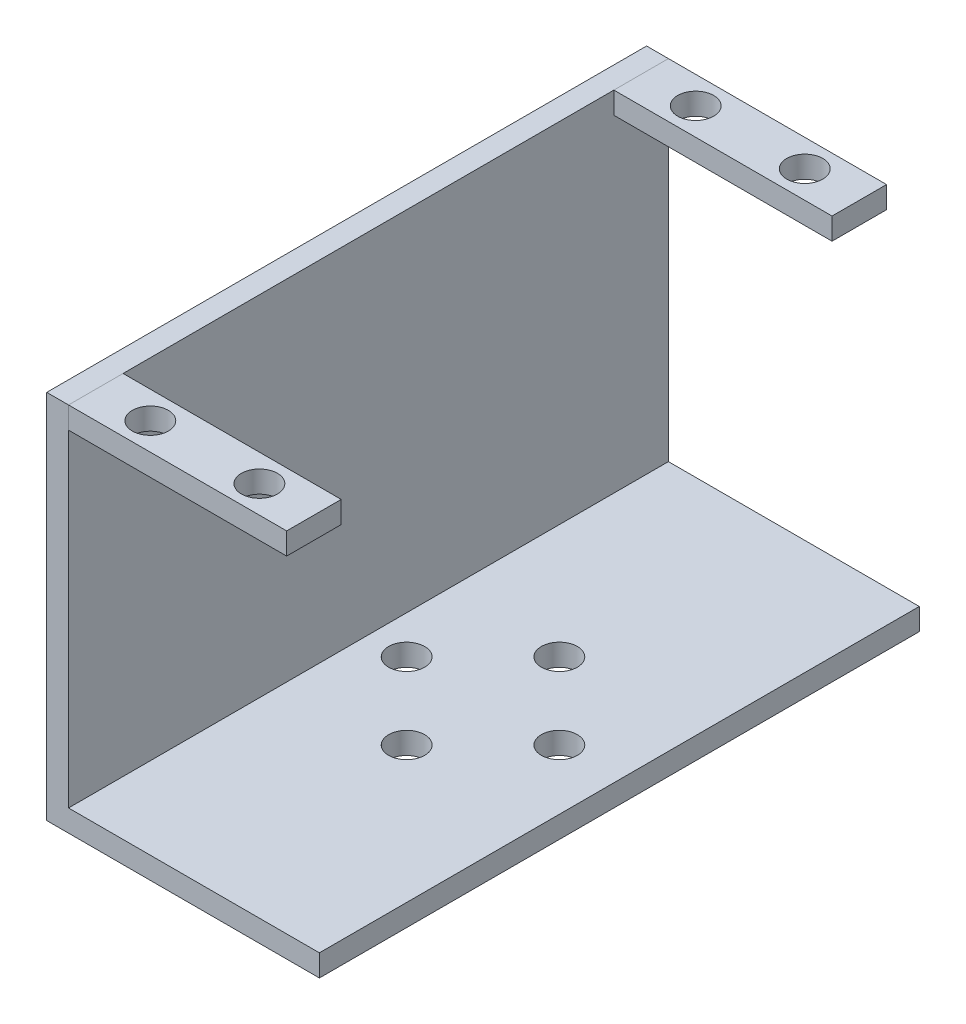
ISO-10303-21;
HEADER;
FILE_DESCRIPTION(('STEP AP214'),'2;1');
FILE_NAME('part.step','',(''),(''),'','','');
FILE_SCHEMA(('AUTOMOTIVE_DESIGN { 1 0 10303 214 1 1 1 1 }'));
ENDSEC;
DATA;
#1=APPLICATION_CONTEXT('core data for automotive mechanical design processes');
#2=APPLICATION_PROTOCOL_DEFINITION('international standard','automotive_design',2000,#1);
#3=PRODUCT_CONTEXT('',#1,'mechanical');
#4=PRODUCT('Part','Part','',(#3));
#5=PRODUCT_RELATED_PRODUCT_CATEGORY('part','',(#4));
#6=PRODUCT_DEFINITION_FORMATION('','',#4);
#7=PRODUCT_DEFINITION_CONTEXT('part definition',#1,'design');
#8=PRODUCT_DEFINITION('design','',#6,#7);
#9=PRODUCT_DEFINITION_SHAPE('','',#8);
#10=(LENGTH_UNIT() NAMED_UNIT(*) SI_UNIT(.MILLI.,.METRE.));
#11=(NAMED_UNIT(*) PLANE_ANGLE_UNIT() SI_UNIT($,.RADIAN.));
#12=(NAMED_UNIT(*) SI_UNIT($,.STERADIAN.) SOLID_ANGLE_UNIT());
#13=UNCERTAINTY_MEASURE_WITH_UNIT(LENGTH_MEASURE(1.E-05),#10,'distance_accuracy_value','');
#14=(GEOMETRIC_REPRESENTATION_CONTEXT(3) GLOBAL_UNCERTAINTY_ASSIGNED_CONTEXT((#13)) GLOBAL_UNIT_ASSIGNED_CONTEXT((#10,
#11,#12)) REPRESENTATION_CONTEXT('',''));
#15=CARTESIAN_POINT('',(0.,0.,0.));
#16=DIRECTION('',(0.,0.,1.));
#17=DIRECTION('',(1.,0.,0.));
#18=AXIS2_PLACEMENT_3D('',#15,#16,#17);
#19=CARTESIAN_POINT('',(9.5,32.,-22.5));
#20=DIRECTION('',(0.,0.,-1.));
#21=DIRECTION('',(0.,1.,0.));
#22=AXIS2_PLACEMENT_3D('',#19,#20,#21);
#23=PLANE('',#22);
#24=DIRECTION('',(0.,-1.,0.));
#25=VECTOR('',#24,1.);
#26=CARTESIAN_POINT('',(-10.5,32.,-22.5));
#27=LINE('',#26,#25);
#28=CARTESIAN_POINT('',(-10.5,34.,-22.5));
#29=VERTEX_POINT('',#28);
#30=CARTESIAN_POINT('',(-10.5,32.,-22.5));
#31=VERTEX_POINT('',#30);
#32=EDGE_CURVE('E122',#29,#31,#27,.T.);
#33=ORIENTED_EDGE('',*,*,#32,.T.);
#34=DIRECTION('',(-1.,0.,0.));
#35=VECTOR('',#34,1.);
#36=CARTESIAN_POINT('',(9.5,32.,-22.5));
#37=LINE('',#36,#35);
#38=CARTESIAN_POINT('',(9.5,32.,-22.5));
#39=VERTEX_POINT('',#38);
#40=EDGE_CURVE('E12',#39,#31,#37,.T.);
#41=ORIENTED_EDGE('',*,*,#40,.F.);
#42=DIRECTION('',(0.,-1.,0.));
#43=VECTOR('',#42,1.);
#44=CARTESIAN_POINT('',(9.5,32.,-22.5));
#45=LINE('',#44,#43);
#46=CARTESIAN_POINT('',(9.5,34.,-22.5));
#47=VERTEX_POINT('',#46);
#48=EDGE_CURVE('E105',#47,#39,#45,.T.);
#49=ORIENTED_EDGE('',*,*,#48,.F.);
#50=DIRECTION('',(-1.,0.,0.));
#51=VECTOR('',#50,1.);
#52=CARTESIAN_POINT('',(9.5,34.,-22.5));
#53=LINE('',#52,#51);
#54=EDGE_CURVE('E118',#47,#29,#53,.T.);
#55=ORIENTED_EDGE('',*,*,#54,.T.);
#56=EDGE_LOOP('',(#33,#41,#49,#55));
#57=FACE_BOUND('',#56,.T.);
#58=ADVANCED_FACE('F53',(#57),#23,.F.);
#59=CARTESIAN_POINT('',(9.5,32.,-22.5));
#60=DIRECTION('',(0.,1.,0.));
#61=DIRECTION('',(0.,0.,1.));
#62=AXIS2_PLACEMENT_3D('',#59,#60,#61);
#63=PLANE('',#62);
#64=CARTESIAN_POINT('',(4.5,32.,-25.));
#65=DIRECTION('',(0.,1.,0.));
#66=DIRECTION('',(0.,0.,1.));
#67=AXIS2_PLACEMENT_3D('',#64,#65,#66);
#68=CIRCLE('',#67,1.65);
#69=CARTESIAN_POINT('',(4.5,32.,-23.35));
#70=VERTEX_POINT('',#69);
#71=EDGE_CURVE('E126',#70,#70,#68,.F.);
#72=ORIENTED_EDGE('',*,*,#71,.F.);
#73=EDGE_LOOP('',(#72));
#74=FACE_BOUND('',#73,.T.);
#75=CARTESIAN_POINT('',(-5.5,32.,-25.));
#76=DIRECTION('',(0.,1.,0.));
#77=DIRECTION('',(0.,0.,1.));
#78=AXIS2_PLACEMENT_3D('',#75,#76,#77);
#79=CIRCLE('',#78,1.65);
#80=CARTESIAN_POINT('',(-5.5,32.,-23.35));
#81=VERTEX_POINT('',#80);
#82=EDGE_CURVE('E145',#81,#81,#79,.F.);
#83=ORIENTED_EDGE('',*,*,#82,.F.);
#84=EDGE_LOOP('',(#83));
#85=FACE_BOUND('',#84,.T.);
#86=DIRECTION('',(0.,0.,-1.));
#87=VECTOR('',#86,1.);
#88=CARTESIAN_POINT('',(-10.5,32.,-22.5));
#89=LINE('',#88,#87);
#90=CARTESIAN_POINT('',(-10.5,32.,-27.5));
#91=VERTEX_POINT('',#90);
#92=EDGE_CURVE('E110',#31,#91,#89,.T.);
#93=ORIENTED_EDGE('',*,*,#92,.T.);
#94=DIRECTION('',(-1.,0.,0.));
#95=VECTOR('',#94,1.);
#96=CARTESIAN_POINT('',(9.5,32.,-27.5));
#97=LINE('',#96,#95);
#98=CARTESIAN_POINT('',(9.5,32.,-27.5));
#99=VERTEX_POINT('',#98);
#100=EDGE_CURVE('E62',#99,#91,#97,.T.);
#101=ORIENTED_EDGE('',*,*,#100,.F.);
#102=DIRECTION('',(0.,0.,-1.));
#103=VECTOR('',#102,1.);
#104=CARTESIAN_POINT('',(9.5,32.,-22.5));
#105=LINE('',#104,#103);
#106=EDGE_CURVE('E100',#39,#99,#105,.T.);
#107=ORIENTED_EDGE('',*,*,#106,.F.);
#108=ORIENTED_EDGE('',*,*,#40,.T.);
#109=EDGE_LOOP('',(#93,#101,#107,#108));
#110=FACE_BOUND('',#109,.T.);
#111=ADVANCED_FACE('F109',(#74,#85,#110),#63,.F.);
#112=CARTESIAN_POINT('',(9.5,32.,-27.5));
#113=DIRECTION('',(0.,0.,1.));
#114=DIRECTION('',(1.,0.,0.));
#115=AXIS2_PLACEMENT_3D('',#112,#113,#114);
#116=PLANE('',#115);
#117=DIRECTION('',(0.,1.,0.));
#118=VECTOR('',#117,1.);
#119=CARTESIAN_POINT('',(-10.5,32.,-27.5));
#120=LINE('',#119,#118);
#121=CARTESIAN_POINT('',(-10.5,34.,-27.5));
#122=VERTEX_POINT('',#121);
#123=EDGE_CURVE('E87',#91,#122,#120,.T.);
#124=ORIENTED_EDGE('',*,*,#123,.T.);
#125=DIRECTION('',(-1.,0.,0.));
#126=VECTOR('',#125,1.);
#127=CARTESIAN_POINT('',(9.5,34.,-27.5));
#128=LINE('',#127,#126);
#129=CARTESIAN_POINT('',(9.5,34.,-27.5));
#130=VERTEX_POINT('',#129);
#131=EDGE_CURVE('E112',#130,#122,#128,.T.);
#132=ORIENTED_EDGE('',*,*,#131,.F.);
#133=DIRECTION('',(0.,1.,0.));
#134=VECTOR('',#133,1.);
#135=CARTESIAN_POINT('',(9.5,32.,-27.5));
#136=LINE('',#135,#134);
#137=EDGE_CURVE('E103',#99,#130,#136,.T.);
#138=ORIENTED_EDGE('',*,*,#137,.F.);
#139=ORIENTED_EDGE('',*,*,#100,.T.);
#140=EDGE_LOOP('',(#124,#132,#138,#139));
#141=FACE_BOUND('',#140,.T.);
#142=ADVANCED_FACE('F113',(#141),#116,.F.);
#143=CARTESIAN_POINT('',(9.5,34.,-22.5));
#144=DIRECTION('',(0.,-1.,0.));
#145=DIRECTION('',(0.,0.,-1.));
#146=AXIS2_PLACEMENT_3D('',#143,#144,#145);
#147=PLANE('',#146);
#148=CARTESIAN_POINT('',(4.5,34.,-25.));
#149=DIRECTION('',(0.,1.,0.));
#150=DIRECTION('',(0.,0.,-1.));
#151=AXIS2_PLACEMENT_3D('',#148,#149,#150);
#152=CIRCLE('',#151,1.65);
#153=CARTESIAN_POINT('',(4.5,34.,-26.65));
#154=VERTEX_POINT('',#153);
#155=EDGE_CURVE('E149',#154,#154,#152,.T.);
#156=ORIENTED_EDGE('',*,*,#155,.F.);
#157=EDGE_LOOP('',(#156));
#158=FACE_BOUND('',#157,.T.);
#159=CARTESIAN_POINT('',(-5.5,34.,-25.));
#160=DIRECTION('',(0.,1.,0.));
#161=DIRECTION('',(0.,0.,-1.));
#162=AXIS2_PLACEMENT_3D('',#159,#160,#161);
#163=CIRCLE('',#162,1.65);
#164=CARTESIAN_POINT('',(-5.5,34.,-26.65));
#165=VERTEX_POINT('',#164);
#166=EDGE_CURVE('E150',#165,#165,#163,.T.);
#167=ORIENTED_EDGE('',*,*,#166,.F.);
#168=EDGE_LOOP('',(#167));
#169=FACE_BOUND('',#168,.T.);
#170=DIRECTION('',(0.,0.,1.));
#171=VECTOR('',#170,1.);
#172=CARTESIAN_POINT('',(-10.5,34.,-22.5));
#173=LINE('',#172,#171);
#174=EDGE_CURVE('E93',#122,#29,#173,.T.);
#175=ORIENTED_EDGE('',*,*,#174,.T.);
#176=ORIENTED_EDGE('',*,*,#54,.F.);
#177=DIRECTION('',(0.,0.,1.));
#178=VECTOR('',#177,1.);
#179=CARTESIAN_POINT('',(9.5,34.,-22.5));
#180=LINE('',#179,#178);
#181=EDGE_CURVE('E70',#130,#47,#180,.T.);
#182=ORIENTED_EDGE('',*,*,#181,.F.);
#183=ORIENTED_EDGE('',*,*,#131,.T.);
#184=EDGE_LOOP('',(#175,#176,#182,#183));
#185=FACE_BOUND('',#184,.T.);
#186=ADVANCED_FACE('F137',(#158,#169,#185),#147,.F.);
#187=CARTESIAN_POINT('',(9.5,0.,0.));
#188=DIRECTION('',(-1.,0.,0.));
#189=DIRECTION('',(0.,0.,1.));
#190=AXIS2_PLACEMENT_3D('',#187,#188,#189);
#191=PLANE('',#190);
#192=ORIENTED_EDGE('',*,*,#48,.T.);
#193=ORIENTED_EDGE('',*,*,#106,.T.);
#194=ORIENTED_EDGE('',*,*,#137,.T.);
#195=ORIENTED_EDGE('',*,*,#181,.T.);
#196=EDGE_LOOP('',(#192,#193,#194,#195));
#197=FACE_BOUND('',#196,.T.);
#198=ADVANCED_FACE('F101',(#197),#191,.F.);
#199=CARTESIAN_POINT('',(-10.5,0.,0.));
#200=DIRECTION('',(-1.,0.,0.));
#201=DIRECTION('',(0.,0.,1.));
#202=AXIS2_PLACEMENT_3D('',#199,#200,#201);
#203=PLANE('',#202);
#204=ORIENTED_EDGE('',*,*,#32,.F.);
#205=ORIENTED_EDGE('',*,*,#174,.F.);
#206=ORIENTED_EDGE('',*,*,#123,.F.);
#207=ORIENTED_EDGE('',*,*,#92,.F.);
#208=EDGE_LOOP('',(#204,#205,#206,#207));
#209=FACE_BOUND('',#208,.T.);
#210=ADVANCED_FACE('F140',(#209),#203,.T.);
#211=CARTESIAN_POINT('',(-5.5,-0.001000000000001,-25.));
#212=DIRECTION('',(0.,1.,0.));
#213=DIRECTION('',(0.,0.,1.));
#214=AXIS2_PLACEMENT_3D('',#211,#212,#213);
#215=CYLINDRICAL_SURFACE('',#214,1.65);
#216=ORIENTED_EDGE('',*,*,#166,.T.);
#217=EDGE_LOOP('',(#216));
#218=FACE_BOUND('',#217,.T.);
#219=ORIENTED_EDGE('',*,*,#82,.T.);
#220=EDGE_LOOP('',(#219));
#221=FACE_BOUND('',#220,.T.);
#222=ADVANCED_FACE('F170',(#218,#221),#215,.F.);
#223=CARTESIAN_POINT('',(4.5,-0.001000000000001,-25.));
#224=DIRECTION('',(0.,1.,0.));
#225=DIRECTION('',(0.,0.,1.));
#226=AXIS2_PLACEMENT_3D('',#223,#224,#225);
#227=CYLINDRICAL_SURFACE('',#226,1.65);
#228=ORIENTED_EDGE('',*,*,#155,.T.);
#229=EDGE_LOOP('',(#228));
#230=FACE_BOUND('',#229,.T.);
#231=ORIENTED_EDGE('',*,*,#71,.T.);
#232=EDGE_LOOP('',(#231));
#233=FACE_BOUND('',#232,.T.);
#234=ADVANCED_FACE('F162',(#230,#233),#227,.F.);
#235=CLOSED_SHELL('',(#58,#111,#142,#186,#198,#210,#222,#234));
#236=MANIFOLD_SOLID_BREP('B2',#235);
#237=CARTESIAN_POINT('',(9.50000000000001,32.,22.5));
#238=DIRECTION('',(0.,0.,1.));
#239=DIRECTION('',(1.,0.,0.));
#240=AXIS2_PLACEMENT_3D('',#237,#238,#239);
#241=PLANE('',#240);
#242=DIRECTION('',(0.,1.,0.));
#243=VECTOR('',#242,1.);
#244=CARTESIAN_POINT('',(-10.5,32.,22.5));
#245=LINE('',#244,#243);
#246=CARTESIAN_POINT('',(-10.5,32.,22.5));
#247=VERTEX_POINT('',#246);
#248=CARTESIAN_POINT('',(-10.5,34.,22.5));
#249=VERTEX_POINT('',#248);
#250=EDGE_CURVE('E344',#247,#249,#245,.T.);
#251=ORIENTED_EDGE('',*,*,#250,.T.);
#252=DIRECTION('',(-1.,0.,0.));
#253=VECTOR('',#252,1.);
#254=CARTESIAN_POINT('',(9.50000000000001,34.,22.5));
#255=LINE('',#254,#253);
#256=CARTESIAN_POINT('',(9.50000000000001,34.,22.5));
#257=VERTEX_POINT('',#256);
#258=EDGE_CURVE('E51',#257,#249,#255,.T.);
#259=ORIENTED_EDGE('',*,*,#258,.F.);
#260=DIRECTION('',(0.,1.,0.));
#261=VECTOR('',#260,1.);
#262=CARTESIAN_POINT('',(9.50000000000001,32.,22.5));
#263=LINE('',#262,#261);
#264=CARTESIAN_POINT('',(9.50000000000001,32.,22.5));
#265=VERTEX_POINT('',#264);
#266=EDGE_CURVE('E327',#265,#257,#263,.T.);
#267=ORIENTED_EDGE('',*,*,#266,.F.);
#268=DIRECTION('',(-1.,0.,0.));
#269=VECTOR('',#268,1.);
#270=CARTESIAN_POINT('',(9.50000000000001,32.,22.5));
#271=LINE('',#270,#269);
#272=EDGE_CURVE('E340',#265,#247,#271,.T.);
#273=ORIENTED_EDGE('',*,*,#272,.T.);
#274=EDGE_LOOP('',(#251,#259,#267,#273));
#275=FACE_BOUND('',#274,.T.);
#276=ADVANCED_FACE('F275',(#275),#241,.F.);
#277=CARTESIAN_POINT('',(9.50000000000001,34.,22.5));
#278=DIRECTION('',(0.,-1.,0.));
#279=DIRECTION('',(0.,0.,-1.));
#280=AXIS2_PLACEMENT_3D('',#277,#278,#279);
#281=PLANE('',#280);
#282=CARTESIAN_POINT('',(-5.5,34.,25.));
#283=DIRECTION('',(0.,1.,0.));
#284=DIRECTION('',(0.,0.,1.));
#285=AXIS2_PLACEMENT_3D('',#282,#283,#284);
#286=CIRCLE('',#285,1.65);
#287=CARTESIAN_POINT('',(-5.5,34.,26.65));
#288=VERTEX_POINT('',#287);
#289=EDGE_CURVE('E371',#288,#288,#286,.T.);
#290=ORIENTED_EDGE('',*,*,#289,.F.);
#291=EDGE_LOOP('',(#290));
#292=FACE_BOUND('',#291,.T.);
#293=CARTESIAN_POINT('',(4.5,34.,25.));
#294=DIRECTION('',(0.,1.,0.));
#295=DIRECTION('',(0.,0.,1.));
#296=AXIS2_PLACEMENT_3D('',#293,#294,#295);
#297=CIRCLE('',#296,1.65);
#298=CARTESIAN_POINT('',(4.5,34.,26.65));
#299=VERTEX_POINT('',#298);
#300=EDGE_CURVE('E372',#299,#299,#297,.T.);
#301=ORIENTED_EDGE('',*,*,#300,.F.);
#302=EDGE_LOOP('',(#301));
#303=FACE_BOUND('',#302,.T.);
#304=DIRECTION('',(0.,0.,1.));
#305=VECTOR('',#304,1.);
#306=CARTESIAN_POINT('',(-10.5,34.,22.5));
#307=LINE('',#306,#305);
#308=CARTESIAN_POINT('',(-10.5,34.,27.5));
#309=VERTEX_POINT('',#308);
#310=EDGE_CURVE('E332',#249,#309,#307,.T.);
#311=ORIENTED_EDGE('',*,*,#310,.T.);
#312=DIRECTION('',(-1.,0.,0.));
#313=VECTOR('',#312,1.);
#314=CARTESIAN_POINT('',(9.50000000000001,34.,27.5));
#315=LINE('',#314,#313);
#316=CARTESIAN_POINT('',(9.50000000000001,34.,27.5));
#317=VERTEX_POINT('',#316);
#318=EDGE_CURVE('E284',#317,#309,#315,.T.);
#319=ORIENTED_EDGE('',*,*,#318,.F.);
#320=DIRECTION('',(0.,0.,1.));
#321=VECTOR('',#320,1.);
#322=CARTESIAN_POINT('',(9.50000000000001,34.,22.5));
#323=LINE('',#322,#321);
#324=EDGE_CURVE('E322',#257,#317,#323,.T.);
#325=ORIENTED_EDGE('',*,*,#324,.F.);
#326=ORIENTED_EDGE('',*,*,#258,.T.);
#327=EDGE_LOOP('',(#311,#319,#325,#326));
#328=FACE_BOUND('',#327,.T.);
#329=ADVANCED_FACE('F331',(#292,#303,#328),#281,.F.);
#330=CARTESIAN_POINT('',(9.50000000000001,32.,27.5));
#331=DIRECTION('',(0.,0.,-1.));
#332=DIRECTION('',(-1.,0.,0.));
#333=AXIS2_PLACEMENT_3D('',#330,#331,#332);
#334=PLANE('',#333);
#335=DIRECTION('',(0.,-1.,0.));
#336=VECTOR('',#335,1.);
#337=CARTESIAN_POINT('',(-10.5,32.,27.5));
#338=LINE('',#337,#336);
#339=CARTESIAN_POINT('',(-10.5,32.,27.5));
#340=VERTEX_POINT('',#339);
#341=EDGE_CURVE('E309',#309,#340,#338,.T.);
#342=ORIENTED_EDGE('',*,*,#341,.T.);
#343=DIRECTION('',(-1.,0.,0.));
#344=VECTOR('',#343,1.);
#345=CARTESIAN_POINT('',(9.50000000000001,32.,27.5));
#346=LINE('',#345,#344);
#347=CARTESIAN_POINT('',(9.50000000000001,32.,27.5));
#348=VERTEX_POINT('',#347);
#349=EDGE_CURVE('E334',#348,#340,#346,.T.);
#350=ORIENTED_EDGE('',*,*,#349,.F.);
#351=DIRECTION('',(0.,-1.,0.));
#352=VECTOR('',#351,1.);
#353=CARTESIAN_POINT('',(9.50000000000001,32.,27.5));
#354=LINE('',#353,#352);
#355=EDGE_CURVE('E325',#317,#348,#354,.T.);
#356=ORIENTED_EDGE('',*,*,#355,.F.);
#357=ORIENTED_EDGE('',*,*,#318,.T.);
#358=EDGE_LOOP('',(#342,#350,#356,#357));
#359=FACE_BOUND('',#358,.T.);
#360=ADVANCED_FACE('F335',(#359),#334,.F.);
#361=CARTESIAN_POINT('',(9.50000000000001,32.,22.5));
#362=DIRECTION('',(0.,1.,0.));
#363=DIRECTION('',(0.,0.,1.));
#364=AXIS2_PLACEMENT_3D('',#361,#362,#363);
#365=PLANE('',#364);
#366=CARTESIAN_POINT('',(-5.5,32.,25.));
#367=DIRECTION('',(0.,1.,0.));
#368=DIRECTION('',(0.,0.,1.));
#369=AXIS2_PLACEMENT_3D('',#366,#367,#368);
#370=CIRCLE('',#369,1.65);
#371=CARTESIAN_POINT('',(-5.5,32.,26.65));
#372=VERTEX_POINT('',#371);
#373=EDGE_CURVE('E348',#372,#372,#370,.F.);
#374=ORIENTED_EDGE('',*,*,#373,.F.);
#375=EDGE_LOOP('',(#374));
#376=FACE_BOUND('',#375,.T.);
#377=CARTESIAN_POINT('',(4.5,32.,25.));
#378=DIRECTION('',(0.,1.,0.));
#379=DIRECTION('',(0.,0.,1.));
#380=AXIS2_PLACEMENT_3D('',#377,#378,#379);
#381=CIRCLE('',#380,1.65);
#382=CARTESIAN_POINT('',(4.5,32.,26.65));
#383=VERTEX_POINT('',#382);
#384=EDGE_CURVE('E367',#383,#383,#381,.F.);
#385=ORIENTED_EDGE('',*,*,#384,.F.);
#386=EDGE_LOOP('',(#385));
#387=FACE_BOUND('',#386,.T.);
#388=DIRECTION('',(0.,0.,-1.));
#389=VECTOR('',#388,1.);
#390=CARTESIAN_POINT('',(-10.5,32.,22.5));
#391=LINE('',#390,#389);
#392=EDGE_CURVE('E315',#340,#247,#391,.T.);
#393=ORIENTED_EDGE('',*,*,#392,.T.);
#394=ORIENTED_EDGE('',*,*,#272,.F.);
#395=DIRECTION('',(0.,0.,-1.));
#396=VECTOR('',#395,1.);
#397=CARTESIAN_POINT('',(9.50000000000001,32.,22.5));
#398=LINE('',#397,#396);
#399=EDGE_CURVE('E292',#348,#265,#398,.T.);
#400=ORIENTED_EDGE('',*,*,#399,.F.);
#401=ORIENTED_EDGE('',*,*,#349,.T.);
#402=EDGE_LOOP('',(#393,#394,#400,#401));
#403=FACE_BOUND('',#402,.T.);
#404=ADVANCED_FACE('F359',(#376,#387,#403),#365,.F.);
#405=CARTESIAN_POINT('',(9.50000000000001,0.,0.));
#406=DIRECTION('',(1.,0.,0.));
#407=DIRECTION('',(0.,0.,-1.));
#408=AXIS2_PLACEMENT_3D('',#405,#406,#407);
#409=PLANE('',#408);
#410=ORIENTED_EDGE('',*,*,#266,.T.);
#411=ORIENTED_EDGE('',*,*,#324,.T.);
#412=ORIENTED_EDGE('',*,*,#355,.T.);
#413=ORIENTED_EDGE('',*,*,#399,.T.);
#414=EDGE_LOOP('',(#410,#411,#412,#413));
#415=FACE_BOUND('',#414,.T.);
#416=ADVANCED_FACE('F323',(#415),#409,.T.);
#417=CARTESIAN_POINT('',(-10.5,0.,0.));
#418=DIRECTION('',(1.,0.,0.));
#419=DIRECTION('',(0.,0.,-1.));
#420=AXIS2_PLACEMENT_3D('',#417,#418,#419);
#421=PLANE('',#420);
#422=ORIENTED_EDGE('',*,*,#250,.F.);
#423=ORIENTED_EDGE('',*,*,#392,.F.);
#424=ORIENTED_EDGE('',*,*,#341,.F.);
#425=ORIENTED_EDGE('',*,*,#310,.F.);
#426=EDGE_LOOP('',(#422,#423,#424,#425));
#427=FACE_BOUND('',#426,.T.);
#428=ADVANCED_FACE('F362',(#427),#421,.F.);
#429=CARTESIAN_POINT('',(4.5,-0.001000000000001,25.));
#430=DIRECTION('',(0.,1.,0.));
#431=DIRECTION('',(0.,0.,1.));
#432=AXIS2_PLACEMENT_3D('',#429,#430,#431);
#433=CYLINDRICAL_SURFACE('',#432,1.65);
#434=ORIENTED_EDGE('',*,*,#300,.T.);
#435=EDGE_LOOP('',(#434));
#436=FACE_BOUND('',#435,.T.);
#437=ORIENTED_EDGE('',*,*,#384,.T.);
#438=EDGE_LOOP('',(#437));
#439=FACE_BOUND('',#438,.T.);
#440=ADVANCED_FACE('F391',(#436,#439),#433,.F.);
#441=CARTESIAN_POINT('',(-5.5,-0.001000000000001,25.));
#442=DIRECTION('',(0.,1.,0.));
#443=DIRECTION('',(0.,0.,1.));
#444=AXIS2_PLACEMENT_3D('',#441,#442,#443);
#445=CYLINDRICAL_SURFACE('',#444,1.65);
#446=ORIENTED_EDGE('',*,*,#289,.T.);
#447=EDGE_LOOP('',(#446));
#448=FACE_BOUND('',#447,.T.);
#449=ORIENTED_EDGE('',*,*,#373,.T.);
#450=EDGE_LOOP('',(#449));
#451=FACE_BOUND('',#450,.T.);
#452=ADVANCED_FACE('F384',(#448,#451),#445,.F.);
#453=CLOSED_SHELL('',(#276,#329,#360,#404,#416,#428,#440,#452));
#454=MANIFOLD_SOLID_BREP('B6',#453);
#455=CARTESIAN_POINT('',(0.,2.,0.));
#456=DIRECTION('',(0.,-1.,0.));
#457=DIRECTION('',(0.,0.,-1.));
#458=AXIS2_PLACEMENT_3D('',#455,#456,#457);
#459=PLANE('',#458);
#460=CARTESIAN_POINT('',(0.,2.,7.));
#461=DIRECTION('',(0.,1.,0.));
#462=DIRECTION('',(0.,0.,1.));
#463=AXIS2_PLACEMENT_3D('',#460,#461,#462);
#464=CIRCLE('',#463,1.65);
#465=CARTESIAN_POINT('',(0.,2.,8.65));
#466=VERTEX_POINT('',#465);
#467=EDGE_CURVE('E609',#466,#466,#464,.T.);
#468=ORIENTED_EDGE('',*,*,#467,.F.);
#469=EDGE_LOOP('',(#468));
#470=FACE_BOUND('',#469,.T.);
#471=CARTESIAN_POINT('',(-7.,2.,0.));
#472=DIRECTION('',(0.,1.,0.));
#473=DIRECTION('',(0.,0.,1.));
#474=AXIS2_PLACEMENT_3D('',#471,#472,#473);
#475=CIRCLE('',#474,1.65);
#476=CARTESIAN_POINT('',(-7.,2.,1.65));
#477=VERTEX_POINT('',#476);
#478=EDGE_CURVE('E626',#477,#477,#475,.T.);
#479=ORIENTED_EDGE('',*,*,#478,.F.);
#480=EDGE_LOOP('',(#479));
#481=FACE_BOUND('',#480,.T.);
#482=CARTESIAN_POINT('',(0.,2.,-7.));
#483=DIRECTION('',(0.,1.,0.));
#484=DIRECTION('',(0.,0.,1.));
#485=AXIS2_PLACEMENT_3D('',#482,#483,#484);
#486=CIRCLE('',#485,1.65);
#487=CARTESIAN_POINT('',(0.,2.,-5.35));
#488=VERTEX_POINT('',#487);
#489=EDGE_CURVE('E618',#488,#488,#486,.T.);
#490=ORIENTED_EDGE('',*,*,#489,.F.);
#491=EDGE_LOOP('',(#490));
#492=FACE_BOUND('',#491,.T.);
#493=CARTESIAN_POINT('',(7.,2.,0.));
#494=DIRECTION('',(0.,1.,0.));
#495=DIRECTION('',(0.,0.,1.));
#496=AXIS2_PLACEMENT_3D('',#493,#494,#495);
#497=CIRCLE('',#496,1.65);
#498=CARTESIAN_POINT('',(7.,2.,1.65));
#499=VERTEX_POINT('',#498);
#500=EDGE_CURVE('E560',#499,#499,#497,.T.);
#501=ORIENTED_EDGE('',*,*,#500,.F.);
#502=EDGE_LOOP('',(#501));
#503=FACE_BOUND('',#502,.T.);
#504=DIRECTION('',(0.,0.,-1.));
#505=VECTOR('',#504,1.);
#506=CARTESIAN_POINT('',(-10.5,2.,-27.5));
#507=LINE('',#506,#505);
#508=CARTESIAN_POINT('',(-10.5,2.,27.5));
#509=VERTEX_POINT('',#508);
#510=CARTESIAN_POINT('',(-10.5,2.,-27.5));
#511=VERTEX_POINT('',#510);
#512=EDGE_CURVE('E504',#509,#511,#507,.T.);
#513=ORIENTED_EDGE('',*,*,#512,.F.);
#514=DIRECTION('',(1.,0.,0.));
#515=VECTOR('',#514,1.);
#516=CARTESIAN_POINT('',(-12.5,2.,27.5));
#517=LINE('',#516,#515);
#518=CARTESIAN_POINT('',(12.5,2.,27.5));
#519=VERTEX_POINT('',#518);
#520=EDGE_CURVE('E509',#509,#519,#517,.T.);
#521=ORIENTED_EDGE('',*,*,#520,.T.);
#522=DIRECTION('',(0.,0.,-1.));
#523=VECTOR('',#522,1.);
#524=CARTESIAN_POINT('',(12.5,2.,27.5));
#525=LINE('',#524,#523);
#526=CARTESIAN_POINT('',(12.5,2.,-27.5));
#527=VERTEX_POINT('',#526);
#528=EDGE_CURVE('E541',#519,#527,#525,.T.);
#529=ORIENTED_EDGE('',*,*,#528,.T.);
#530=DIRECTION('',(-1.,0.,0.));
#531=VECTOR('',#530,1.);
#532=CARTESIAN_POINT('',(-12.5,2.,-27.5));
#533=LINE('',#532,#531);
#534=EDGE_CURVE('E638',#527,#511,#533,.T.);
#535=ORIENTED_EDGE('',*,*,#534,.T.);
#536=EDGE_LOOP('',(#513,#521,#529,#535));
#537=FACE_BOUND('',#536,.T.);
#538=ADVANCED_FACE('F488',(#470,#481,#492,#503,#537),#459,.F.);
#539=CARTESIAN_POINT('',(12.5,2.,27.5));
#540=DIRECTION('',(-1.,0.,0.));
#541=DIRECTION('',(0.,0.,1.));
#542=AXIS2_PLACEMENT_3D('',#539,#540,#541);
#543=PLANE('',#542);
#544=DIRECTION('',(0.,0.,-1.));
#545=VECTOR('',#544,1.);
#546=CARTESIAN_POINT('',(12.5,0.,27.5));
#547=LINE('',#546,#545);
#548=CARTESIAN_POINT('',(12.5,0.,27.5));
#549=VERTEX_POINT('',#548);
#550=CARTESIAN_POINT('',(12.5,0.,-27.5));
#551=VERTEX_POINT('',#550);
#552=EDGE_CURVE('E547',#549,#551,#547,.T.);
#553=ORIENTED_EDGE('',*,*,#552,.T.);
#554=DIRECTION('',(0.,-1.,0.));
#555=VECTOR('',#554,1.);
#556=CARTESIAN_POINT('',(12.5,2.,-27.5));
#557=LINE('',#556,#555);
#558=EDGE_CURVE('E273',#527,#551,#557,.T.);
#559=ORIENTED_EDGE('',*,*,#558,.F.);
#560=ORIENTED_EDGE('',*,*,#528,.F.);
#561=DIRECTION('',(0.,-1.,0.));
#562=VECTOR('',#561,1.);
#563=CARTESIAN_POINT('',(12.5,2.,27.5));
#564=LINE('',#563,#562);
#565=EDGE_CURVE('E532',#519,#549,#564,.T.);
#566=ORIENTED_EDGE('',*,*,#565,.T.);
#567=EDGE_LOOP('',(#553,#559,#560,#566));
#568=FACE_BOUND('',#567,.T.);
#569=ADVANCED_FACE('F490',(#568),#543,.F.);
#570=CARTESIAN_POINT('',(-12.5,2.,-27.5));
#571=DIRECTION('',(0.,0.,1.));
#572=DIRECTION('',(1.,0.,0.));
#573=AXIS2_PLACEMENT_3D('',#570,#571,#572);
#574=PLANE('',#573);
#575=DIRECTION('',(-1.,0.,0.));
#576=VECTOR('',#575,1.);
#577=CARTESIAN_POINT('',(-12.5,0.,-27.5));
#578=LINE('',#577,#576);
#579=CARTESIAN_POINT('',(-12.5,0.,-27.5));
#580=VERTEX_POINT('',#579);
#581=EDGE_CURVE('E551',#551,#580,#578,.T.);
#582=ORIENTED_EDGE('',*,*,#581,.T.);
#583=DIRECTION('',(0.,-1.,0.));
#584=VECTOR('',#583,1.);
#585=CARTESIAN_POINT('',(-12.5,2.,-27.5));
#586=LINE('',#585,#584);
#587=CARTESIAN_POINT('',(-12.5,34.,-27.5));
#588=VERTEX_POINT('',#587);
#589=EDGE_CURVE('E497',#588,#580,#586,.T.);
#590=ORIENTED_EDGE('',*,*,#589,.F.);
#591=DIRECTION('',(-1.,0.,0.));
#592=VECTOR('',#591,1.);
#593=CARTESIAN_POINT('',(-12.5,34.,-27.5));
#594=LINE('',#593,#592);
#595=CARTESIAN_POINT('',(-10.5,34.,-27.5));
#596=VERTEX_POINT('',#595);
#597=EDGE_CURVE('E583',#596,#588,#594,.T.);
#598=ORIENTED_EDGE('',*,*,#597,.F.);
#599=DIRECTION('',(0.,-1.,0.));
#600=VECTOR('',#599,1.);
#601=CARTESIAN_POINT('',(-10.5,34.,-27.5));
#602=LINE('',#601,#600);
#603=EDGE_CURVE('E594',#596,#511,#602,.T.);
#604=ORIENTED_EDGE('',*,*,#603,.T.);
#605=ORIENTED_EDGE('',*,*,#534,.F.);
#606=ORIENTED_EDGE('',*,*,#558,.T.);
#607=EDGE_LOOP('',(#582,#590,#598,#604,#605,#606));
#608=FACE_BOUND('',#607,.T.);
#609=ADVANCED_FACE('F580',(#608),#574,.F.);
#610=CARTESIAN_POINT('',(-12.5,2.,27.5));
#611=DIRECTION('',(1.,0.,0.));
#612=DIRECTION('',(0.,0.,-1.));
#613=AXIS2_PLACEMENT_3D('',#610,#611,#612);
#614=PLANE('',#613);
#615=DIRECTION('',(0.,0.,1.));
#616=VECTOR('',#615,1.);
#617=CARTESIAN_POINT('',(-12.5,0.,27.5));
#618=LINE('',#617,#616);
#619=CARTESIAN_POINT('',(-12.5,0.,27.5));
#620=VERTEX_POINT('',#619);
#621=EDGE_CURVE('E542',#580,#620,#618,.T.);
#622=ORIENTED_EDGE('',*,*,#621,.T.);
#623=DIRECTION('',(0.,-1.,0.));
#624=VECTOR('',#623,1.);
#625=CARTESIAN_POINT('',(-12.5,2.,27.5));
#626=LINE('',#625,#624);
#627=CARTESIAN_POINT('',(-12.5,34.,27.5));
#628=VERTEX_POINT('',#627);
#629=EDGE_CURVE('E536',#628,#620,#626,.T.);
#630=ORIENTED_EDGE('',*,*,#629,.F.);
#631=DIRECTION('',(0.,0.,1.));
#632=VECTOR('',#631,1.);
#633=CARTESIAN_POINT('',(-12.5,34.,-27.5));
#634=LINE('',#633,#632);
#635=EDGE_CURVE('E576',#588,#628,#634,.T.);
#636=ORIENTED_EDGE('',*,*,#635,.F.);
#637=ORIENTED_EDGE('',*,*,#589,.T.);
#638=EDGE_LOOP('',(#622,#630,#636,#637));
#639=FACE_BOUND('',#638,.T.);
#640=ADVANCED_FACE('F574',(#639),#614,.F.);
#641=CARTESIAN_POINT('',(-12.5,2.,27.5));
#642=DIRECTION('',(0.,0.,-1.));
#643=DIRECTION('',(-1.,0.,0.));
#644=AXIS2_PLACEMENT_3D('',#641,#642,#643);
#645=PLANE('',#644);
#646=DIRECTION('',(1.,0.,0.));
#647=VECTOR('',#646,1.);
#648=CARTESIAN_POINT('',(-12.5,0.,27.5));
#649=LINE('',#648,#647);
#650=EDGE_CURVE('E529',#620,#549,#649,.T.);
#651=ORIENTED_EDGE('',*,*,#650,.T.);
#652=ORIENTED_EDGE('',*,*,#565,.F.);
#653=ORIENTED_EDGE('',*,*,#520,.F.);
#654=DIRECTION('',(0.,-1.,0.));
#655=VECTOR('',#654,1.);
#656=CARTESIAN_POINT('',(-10.5,34.,27.5));
#657=LINE('',#656,#655);
#658=CARTESIAN_POINT('',(-10.5,34.,27.5));
#659=VERTEX_POINT('',#658);
#660=EDGE_CURVE('E599',#659,#509,#657,.T.);
#661=ORIENTED_EDGE('',*,*,#660,.F.);
#662=DIRECTION('',(1.,0.,0.));
#663=VECTOR('',#662,1.);
#664=CARTESIAN_POINT('',(-12.5,34.,27.5));
#665=LINE('',#664,#663);
#666=EDGE_CURVE('E601',#628,#659,#665,.T.);
#667=ORIENTED_EDGE('',*,*,#666,.F.);
#668=ORIENTED_EDGE('',*,*,#629,.T.);
#669=EDGE_LOOP('',(#651,#652,#653,#661,#667,#668));
#670=FACE_BOUND('',#669,.T.);
#671=ADVANCED_FACE('F531',(#670),#645,.F.);
#672=CARTESIAN_POINT('',(0.,0.,0.));
#673=DIRECTION('',(0.,-1.,0.));
#674=DIRECTION('',(0.,0.,-1.));
#675=AXIS2_PLACEMENT_3D('',#672,#673,#674);
#676=PLANE('',#675);
#677=CARTESIAN_POINT('',(7.,0.,0.));
#678=DIRECTION('',(0.,1.,0.));
#679=DIRECTION('',(0.,0.,1.));
#680=AXIS2_PLACEMENT_3D('',#677,#678,#679);
#681=CIRCLE('',#680,1.65);
#682=CARTESIAN_POINT('',(7.,0.,1.65));
#683=VERTEX_POINT('',#682);
#684=EDGE_CURVE('E553',#683,#683,#681,.T.);
#685=ORIENTED_EDGE('',*,*,#684,.T.);
#686=EDGE_LOOP('',(#685));
#687=FACE_BOUND('',#686,.T.);
#688=CARTESIAN_POINT('',(0.,0.,-7.));
#689=DIRECTION('',(0.,1.,0.));
#690=DIRECTION('',(0.,0.,1.));
#691=AXIS2_PLACEMENT_3D('',#688,#689,#690);
#692=CIRCLE('',#691,1.65);
#693=CARTESIAN_POINT('',(0.,0.,-5.35));
#694=VERTEX_POINT('',#693);
#695=EDGE_CURVE('E614',#694,#694,#692,.T.);
#696=ORIENTED_EDGE('',*,*,#695,.T.);
#697=EDGE_LOOP('',(#696));
#698=FACE_BOUND('',#697,.T.);
#699=CARTESIAN_POINT('',(-7.,0.,0.));
#700=DIRECTION('',(0.,1.,0.));
#701=DIRECTION('',(0.,0.,1.));
#702=AXIS2_PLACEMENT_3D('',#699,#700,#701);
#703=CIRCLE('',#702,1.65);
#704=CARTESIAN_POINT('',(-7.,0.,1.65));
#705=VERTEX_POINT('',#704);
#706=EDGE_CURVE('E622',#705,#705,#703,.T.);
#707=ORIENTED_EDGE('',*,*,#706,.T.);
#708=EDGE_LOOP('',(#707));
#709=FACE_BOUND('',#708,.T.);
#710=CARTESIAN_POINT('',(0.,0.,7.));
#711=DIRECTION('',(0.,1.,0.));
#712=DIRECTION('',(0.,0.,1.));
#713=AXIS2_PLACEMENT_3D('',#710,#711,#712);
#714=CIRCLE('',#713,1.65);
#715=CARTESIAN_POINT('',(0.,0.,8.65));
#716=VERTEX_POINT('',#715);
#717=EDGE_CURVE('E630',#716,#716,#714,.T.);
#718=ORIENTED_EDGE('',*,*,#717,.T.);
#719=EDGE_LOOP('',(#718));
#720=FACE_BOUND('',#719,.T.);
#721=ORIENTED_EDGE('',*,*,#552,.F.);
#722=ORIENTED_EDGE('',*,*,#650,.F.);
#723=ORIENTED_EDGE('',*,*,#621,.F.);
#724=ORIENTED_EDGE('',*,*,#581,.F.);
#725=EDGE_LOOP('',(#721,#722,#723,#724));
#726=FACE_BOUND('',#725,.T.);
#727=ADVANCED_FACE('F550',(#687,#698,#709,#720,#726),#676,.T.);
#728=CARTESIAN_POINT('',(0.,0.,7.));
#729=DIRECTION('',(0.,1.,0.));
#730=DIRECTION('',(0.,0.,1.));
#731=AXIS2_PLACEMENT_3D('',#728,#729,#730);
#732=CYLINDRICAL_SURFACE('',#731,1.65);
#733=ORIENTED_EDGE('',*,*,#717,.F.);
#734=EDGE_LOOP('',(#733));
#735=FACE_BOUND('',#734,.T.);
#736=ORIENTED_EDGE('',*,*,#467,.T.);
#737=EDGE_LOOP('',(#736));
#738=FACE_BOUND('',#737,.T.);
#739=ADVANCED_FACE('F681',(#735,#738),#732,.F.);
#740=CARTESIAN_POINT('',(-7.,0.,0.));
#741=DIRECTION('',(0.,1.,0.));
#742=DIRECTION('',(0.,0.,1.));
#743=AXIS2_PLACEMENT_3D('',#740,#741,#742);
#744=CYLINDRICAL_SURFACE('',#743,1.65);
#745=ORIENTED_EDGE('',*,*,#706,.F.);
#746=EDGE_LOOP('',(#745));
#747=FACE_BOUND('',#746,.T.);
#748=ORIENTED_EDGE('',*,*,#478,.T.);
#749=EDGE_LOOP('',(#748));
#750=FACE_BOUND('',#749,.T.);
#751=ADVANCED_FACE('F712',(#747,#750),#744,.F.);
#752=CARTESIAN_POINT('',(0.,0.,-7.));
#753=DIRECTION('',(0.,1.,0.));
#754=DIRECTION('',(0.,0.,1.));
#755=AXIS2_PLACEMENT_3D('',#752,#753,#754);
#756=CYLINDRICAL_SURFACE('',#755,1.65);
#757=ORIENTED_EDGE('',*,*,#695,.F.);
#758=EDGE_LOOP('',(#757));
#759=FACE_BOUND('',#758,.T.);
#760=ORIENTED_EDGE('',*,*,#489,.T.);
#761=EDGE_LOOP('',(#760));
#762=FACE_BOUND('',#761,.T.);
#763=ADVANCED_FACE('F668',(#759,#762),#756,.F.);
#764=CARTESIAN_POINT('',(7.,0.,0.));
#765=DIRECTION('',(0.,1.,0.));
#766=DIRECTION('',(0.,0.,1.));
#767=AXIS2_PLACEMENT_3D('',#764,#765,#766);
#768=CYLINDRICAL_SURFACE('',#767,1.65);
#769=ORIENTED_EDGE('',*,*,#684,.F.);
#770=EDGE_LOOP('',(#769));
#771=FACE_BOUND('',#770,.T.);
#772=ORIENTED_EDGE('',*,*,#500,.T.);
#773=EDGE_LOOP('',(#772));
#774=FACE_BOUND('',#773,.T.);
#775=ADVANCED_FACE('F661',(#771,#774),#768,.F.);
#776=CARTESIAN_POINT('',(-10.5,34.,-27.5));
#777=DIRECTION('',(-1.,0.,0.));
#778=DIRECTION('',(0.,0.,1.));
#779=AXIS2_PLACEMENT_3D('',#776,#777,#778);
#780=PLANE('',#779);
#781=ORIENTED_EDGE('',*,*,#512,.T.);
#782=ORIENTED_EDGE('',*,*,#603,.F.);
#783=DIRECTION('',(0.,0.,-1.));
#784=VECTOR('',#783,1.);
#785=CARTESIAN_POINT('',(-10.5,34.,-27.5));
#786=LINE('',#785,#784);
#787=EDGE_CURVE('E591',#659,#596,#786,.T.);
#788=ORIENTED_EDGE('',*,*,#787,.F.);
#789=ORIENTED_EDGE('',*,*,#660,.T.);
#790=EDGE_LOOP('',(#781,#782,#788,#789));
#791=FACE_BOUND('',#790,.T.);
#792=ADVANCED_FACE('F647',(#791),#780,.F.);
#793=CARTESIAN_POINT('',(0.,34.,0.));
#794=DIRECTION('',(0.,1.,0.));
#795=DIRECTION('',(0.,0.,1.));
#796=AXIS2_PLACEMENT_3D('',#793,#794,#795);
#797=PLANE('',#796);
#798=ORIENTED_EDGE('',*,*,#635,.T.);
#799=ORIENTED_EDGE('',*,*,#666,.T.);
#800=ORIENTED_EDGE('',*,*,#787,.T.);
#801=ORIENTED_EDGE('',*,*,#597,.T.);
#802=EDGE_LOOP('',(#798,#799,#800,#801));
#803=FACE_BOUND('',#802,.T.);
#804=ADVANCED_FACE('F587',(#803),#797,.T.);
#805=CLOSED_SHELL('',(#538,#569,#609,#640,#671,#727,#739,#751,#763,#775,#792,#804));
#806=MANIFOLD_SOLID_BREP('B45',#805);
#807=ADVANCED_BREP_SHAPE_REPRESENTATION('',(#18,#236,#454,#806),#14);
#808=SHAPE_DEFINITION_REPRESENTATION(#9,#807);
ENDSEC;
END-ISO-10303-21;
